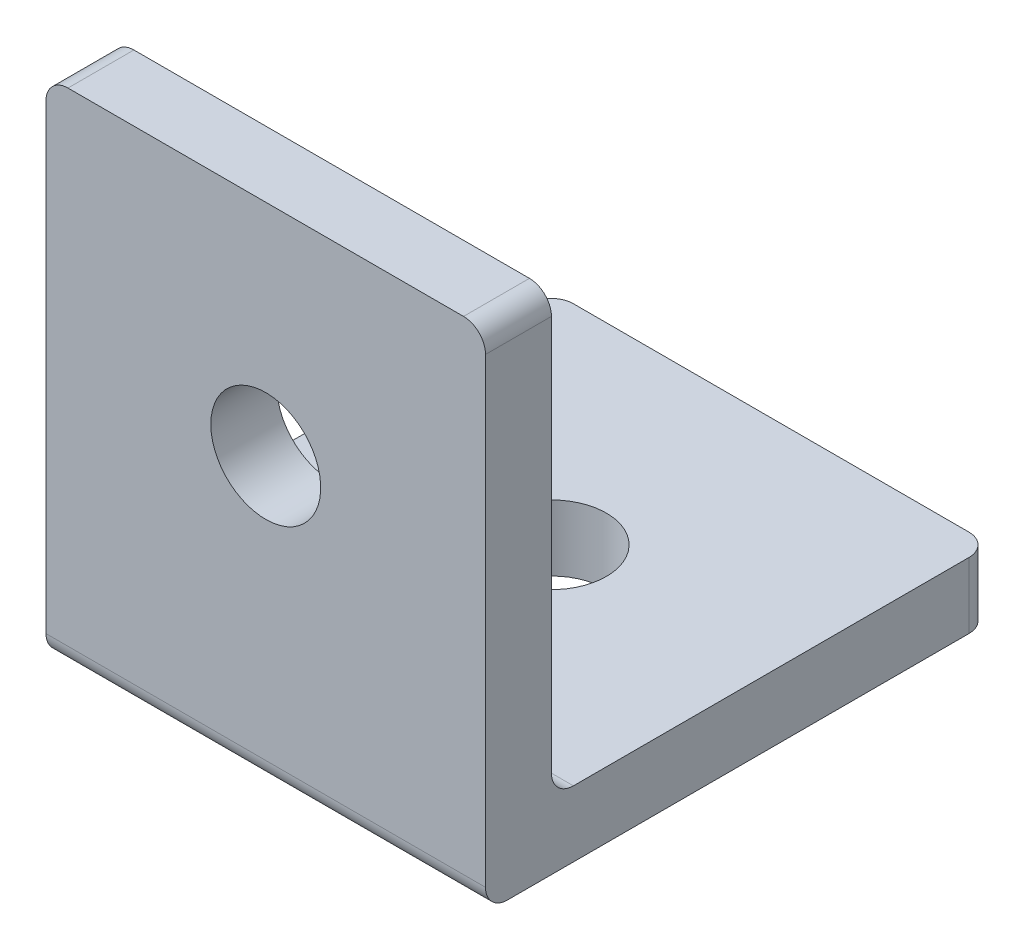
ISO-10303-21;
HEADER;
FILE_DESCRIPTION(('STEP AP214'),'2;1');
FILE_NAME('part.step','',(''),(''),'','','');
FILE_SCHEMA(('AUTOMOTIVE_DESIGN { 1 0 10303 214 1 1 1 1 }'));
ENDSEC;
DATA;
#1=APPLICATION_CONTEXT('core data for automotive mechanical design processes');
#2=APPLICATION_PROTOCOL_DEFINITION('international standard','automotive_design',2000,#1);
#3=PRODUCT_CONTEXT('',#1,'mechanical');
#4=PRODUCT('Part','Part','',(#3));
#5=PRODUCT_RELATED_PRODUCT_CATEGORY('part','',(#4));
#6=PRODUCT_DEFINITION_FORMATION('','',#4);
#7=PRODUCT_DEFINITION_CONTEXT('part definition',#1,'design');
#8=PRODUCT_DEFINITION('design','',#6,#7);
#9=PRODUCT_DEFINITION_SHAPE('','',#8);
#10=(LENGTH_UNIT() NAMED_UNIT(*) SI_UNIT(.MILLI.,.METRE.));
#11=(NAMED_UNIT(*) PLANE_ANGLE_UNIT() SI_UNIT($,.RADIAN.));
#12=(NAMED_UNIT(*) SI_UNIT($,.STERADIAN.) SOLID_ANGLE_UNIT());
#13=UNCERTAINTY_MEASURE_WITH_UNIT(LENGTH_MEASURE(1.E-05),#10,'distance_accuracy_value','');
#14=(GEOMETRIC_REPRESENTATION_CONTEXT(3) GLOBAL_UNCERTAINTY_ASSIGNED_CONTEXT((#13)) GLOBAL_UNIT_ASSIGNED_CONTEXT((#10,
#11,#12)) REPRESENTATION_CONTEXT('',''));
#15=CARTESIAN_POINT('',(0.,0.,0.));
#16=DIRECTION('',(0.,0.,1.));
#17=DIRECTION('',(1.,0.,0.));
#18=AXIS2_PLACEMENT_3D('',#15,#16,#17);
#19=CARTESIAN_POINT('',(-20.,0.,-23.));
#20=DIRECTION('',(0.,0.,-1.));
#21=DIRECTION('',(-1.,0.,0.));
#22=AXIS2_PLACEMENT_3D('',#19,#20,#21);
#23=PLANE('',#22);
#24=DIRECTION('',(1.,0.,0.));
#25=VECTOR('',#24,1.);
#26=CARTESIAN_POINT('',(-20.,0.,-23.));
#27=LINE('',#26,#25);
#28=CARTESIAN_POINT('',(-19.,0.,-23.));
#29=VERTEX_POINT('',#28);
#30=CARTESIAN_POINT('',(-1.,0.,-23.));
#31=VERTEX_POINT('',#30);
#32=EDGE_CURVE('E175',#29,#31,#27,.T.);
#33=ORIENTED_EDGE('',*,*,#32,.F.);
#34=DIRECTION('',(0.,1.,0.));
#35=VECTOR('',#34,1.);
#36=CARTESIAN_POINT('',(-19.,3.,-23.));
#37=LINE('',#36,#35);
#38=CARTESIAN_POINT('',(-19.,3.,-23.));
#39=VERTEX_POINT('',#38);
#40=EDGE_CURVE('E193',#29,#39,#37,.T.);
#41=ORIENTED_EDGE('',*,*,#40,.T.);
#42=DIRECTION('',(1.,0.,0.));
#43=VECTOR('',#42,1.);
#44=CARTESIAN_POINT('',(-20.,3.,-23.));
#45=LINE('',#44,#43);
#46=CARTESIAN_POINT('',(-1.,3.,-23.));
#47=VERTEX_POINT('',#46);
#48=EDGE_CURVE('E143',#39,#47,#45,.T.);
#49=ORIENTED_EDGE('',*,*,#48,.T.);
#50=DIRECTION('',(0.,1.,0.));
#51=VECTOR('',#50,1.);
#52=CARTESIAN_POINT('',(-1.,0.,-23.));
#53=LINE('',#52,#51);
#54=EDGE_CURVE('E178',#47,#31,#53,.F.);
#55=ORIENTED_EDGE('',*,*,#54,.T.);
#56=EDGE_LOOP('',(#33,#41,#49,#55));
#57=FACE_BOUND('',#56,.T.);
#58=ADVANCED_FACE('F33',(#57),#23,.T.);
#59=CARTESIAN_POINT('',(-20.,0.,-1.00000000000001));
#60=DIRECTION('',(0.,-1.,0.));
#61=DIRECTION('',(0.,0.,-1.));
#62=AXIS2_PLACEMENT_3D('',#59,#60,#61);
#63=PLANE('',#62);
#64=CARTESIAN_POINT('',(-10.,0.,-13.));
#65=DIRECTION('',(0.,1.,0.));
#66=DIRECTION('',(0.,0.,1.));
#67=AXIS2_PLACEMENT_3D('',#64,#65,#66);
#68=CIRCLE('',#67,2.5);
#69=CARTESIAN_POINT('',(-10.,0.,-10.5));
#70=VERTEX_POINT('',#69);
#71=EDGE_CURVE('E301',#70,#70,#68,.T.);
#72=ORIENTED_EDGE('',*,*,#71,.T.);
#73=EDGE_LOOP('',(#72));
#74=FACE_BOUND('',#73,.T.);
#75=DIRECTION('',(0.,0.,-1.));
#76=VECTOR('',#75,1.);
#77=CARTESIAN_POINT('',(-20.,0.,-1.00000000000001));
#78=LINE('',#77,#76);
#79=CARTESIAN_POINT('',(-20.,0.,-1.00000000000001));
#80=VERTEX_POINT('',#79);
#81=CARTESIAN_POINT('',(-20.,0.,-22.));
#82=VERTEX_POINT('',#81);
#83=EDGE_CURVE('E158',#80,#82,#78,.T.);
#84=ORIENTED_EDGE('',*,*,#83,.T.);
#85=CARTESIAN_POINT('',(-19.,0.,-22.));
#86=DIRECTION('',(0.,-1.,0.));
#87=DIRECTION('',(0.,0.,-1.));
#88=AXIS2_PLACEMENT_3D('',#85,#86,#87);
#89=CIRCLE('',#88,1.);
#90=EDGE_CURVE('E205',#82,#29,#89,.T.);
#91=ORIENTED_EDGE('',*,*,#90,.T.);
#92=ORIENTED_EDGE('',*,*,#32,.T.);
#93=CARTESIAN_POINT('',(-1.,0.,-22.));
#94=DIRECTION('',(0.,-1.,0.));
#95=DIRECTION('',(0.,0.,-1.));
#96=AXIS2_PLACEMENT_3D('',#93,#94,#95);
#97=CIRCLE('',#96,1.);
#98=CARTESIAN_POINT('',(0.,0.,-22.));
#99=VERTEX_POINT('',#98);
#100=EDGE_CURVE('E203',#31,#99,#97,.T.);
#101=ORIENTED_EDGE('',*,*,#100,.T.);
#102=DIRECTION('',(0.,0.,-1.));
#103=VECTOR('',#102,1.);
#104=CARTESIAN_POINT('',(0.,0.,-1.00000000000001));
#105=LINE('',#104,#103);
#106=CARTESIAN_POINT('',(0.,0.,-1.00000000000001));
#107=VERTEX_POINT('',#106);
#108=EDGE_CURVE('E135',#107,#99,#105,.T.);
#109=ORIENTED_EDGE('',*,*,#108,.F.);
#110=DIRECTION('',(1.,0.,0.));
#111=VECTOR('',#110,1.);
#112=CARTESIAN_POINT('',(-20.,0.,-1.00000000000001));
#113=LINE('',#112,#111);
#114=EDGE_CURVE('E179',#80,#107,#113,.T.);
#115=ORIENTED_EDGE('',*,*,#114,.F.);
#116=EDGE_LOOP('',(#84,#91,#92,#101,#109,#115));
#117=FACE_BOUND('',#116,.T.);
#118=ADVANCED_FACE('F248',(#74,#117),#63,.T.);
#119=CARTESIAN_POINT('',(-20.,1.,-1.));
#120=DIRECTION('',(1.,0.,0.));
#121=DIRECTION('',(0.,0.,-1.));
#122=AXIS2_PLACEMENT_3D('',#119,#120,#121);
#123=CYLINDRICAL_SURFACE('',#122,1.);
#124=CARTESIAN_POINT('',(0.,1.,-1.));
#125=DIRECTION('',(1.,0.,0.));
#126=DIRECTION('',(0.,0.,1.));
#127=AXIS2_PLACEMENT_3D('',#124,#125,#126);
#128=CIRCLE('',#127,1.);
#129=CARTESIAN_POINT('',(0.,1.00000000000001,0.));
#130=VERTEX_POINT('',#129);
#131=EDGE_CURVE('E170',#130,#107,#128,.T.);
#132=ORIENTED_EDGE('',*,*,#131,.F.);
#133=DIRECTION('',(1.,0.,0.));
#134=VECTOR('',#133,1.);
#135=CARTESIAN_POINT('',(-20.,1.00000000000001,0.));
#136=LINE('',#135,#134);
#137=CARTESIAN_POINT('',(-20.,1.00000000000001,0.));
#138=VERTEX_POINT('',#137);
#139=EDGE_CURVE('E181',#138,#130,#136,.T.);
#140=ORIENTED_EDGE('',*,*,#139,.F.);
#141=CARTESIAN_POINT('',(-20.,1.,-1.));
#142=DIRECTION('',(1.,0.,0.));
#143=DIRECTION('',(0.,0.,1.));
#144=AXIS2_PLACEMENT_3D('',#141,#142,#143);
#145=CIRCLE('',#144,1.);
#146=EDGE_CURVE('E155',#138,#80,#145,.T.);
#147=ORIENTED_EDGE('',*,*,#146,.T.);
#148=ORIENTED_EDGE('',*,*,#114,.T.);
#149=EDGE_LOOP('',(#132,#140,#147,#148));
#150=FACE_BOUND('',#149,.T.);
#151=ADVANCED_FACE('F254',(#150),#123,.T.);
#152=CARTESIAN_POINT('',(-20.,1.00000000000001,0.));
#153=DIRECTION('',(0.,0.,1.));
#154=DIRECTION('',(1.,0.,0.));
#155=AXIS2_PLACEMENT_3D('',#152,#153,#154);
#156=PLANE('',#155);
#157=CARTESIAN_POINT('',(-10.,13.,0.));
#158=DIRECTION('',(0.,0.,-1.));
#159=DIRECTION('',(-1.,0.,0.));
#160=AXIS2_PLACEMENT_3D('',#157,#158,#159);
#161=CIRCLE('',#160,2.5);
#162=CARTESIAN_POINT('',(-12.5,13.,0.));
#163=VERTEX_POINT('',#162);
#164=EDGE_CURVE('E163',#163,#163,#161,.T.);
#165=ORIENTED_EDGE('',*,*,#164,.T.);
#166=EDGE_LOOP('',(#165));
#167=FACE_BOUND('',#166,.T.);
#168=DIRECTION('',(1.,0.,0.));
#169=VECTOR('',#168,1.);
#170=CARTESIAN_POINT('',(-20.,23.,0.));
#171=LINE('',#170,#169);
#172=CARTESIAN_POINT('',(-19.,23.,0.));
#173=VERTEX_POINT('',#172);
#174=CARTESIAN_POINT('',(-1.,23.,0.));
#175=VERTEX_POINT('',#174);
#176=EDGE_CURVE('E184',#173,#175,#171,.T.);
#177=ORIENTED_EDGE('',*,*,#176,.F.);
#178=CARTESIAN_POINT('',(-19.,22.,0.));
#179=DIRECTION('',(0.,0.,1.));
#180=DIRECTION('',(1.,0.,0.));
#181=AXIS2_PLACEMENT_3D('',#178,#179,#180);
#182=CIRCLE('',#181,1.);
#183=CARTESIAN_POINT('',(-20.,22.,0.));
#184=VERTEX_POINT('',#183);
#185=EDGE_CURVE('E56',#173,#184,#182,.T.);
#186=ORIENTED_EDGE('',*,*,#185,.T.);
#187=DIRECTION('',(0.,-1.,0.));
#188=VECTOR('',#187,1.);
#189=CARTESIAN_POINT('',(-20.,1.00000000000001,0.));
#190=LINE('',#189,#188);
#191=EDGE_CURVE('E150',#184,#138,#190,.T.);
#192=ORIENTED_EDGE('',*,*,#191,.T.);
#193=ORIENTED_EDGE('',*,*,#139,.T.);
#194=DIRECTION('',(0.,-1.,0.));
#195=VECTOR('',#194,1.);
#196=CARTESIAN_POINT('',(0.,1.00000000000001,0.));
#197=LINE('',#196,#195);
#198=CARTESIAN_POINT('',(0.,22.,0.));
#199=VERTEX_POINT('',#198);
#200=EDGE_CURVE('E168',#199,#130,#197,.T.);
#201=ORIENTED_EDGE('',*,*,#200,.F.);
#202=CARTESIAN_POINT('',(-1.,22.,0.));
#203=DIRECTION('',(0.,0.,1.));
#204=DIRECTION('',(1.,0.,0.));
#205=AXIS2_PLACEMENT_3D('',#202,#203,#204);
#206=CIRCLE('',#205,1.);
#207=EDGE_CURVE('E48',#199,#175,#206,.T.);
#208=ORIENTED_EDGE('',*,*,#207,.T.);
#209=EDGE_LOOP('',(#177,#186,#192,#193,#201,#208));
#210=FACE_BOUND('',#209,.T.);
#211=ADVANCED_FACE('F230',(#167,#210),#156,.T.);
#212=CARTESIAN_POINT('',(-20.,23.,0.));
#213=DIRECTION('',(0.,1.,0.));
#214=DIRECTION('',(0.,0.,1.));
#215=AXIS2_PLACEMENT_3D('',#212,#213,#214);
#216=PLANE('',#215);
#217=DIRECTION('',(1.,0.,0.));
#218=VECTOR('',#217,1.);
#219=CARTESIAN_POINT('',(-20.,23.,-3.));
#220=LINE('',#219,#218);
#221=CARTESIAN_POINT('',(-19.,23.,-3.));
#222=VERTEX_POINT('',#221);
#223=CARTESIAN_POINT('',(-1.,23.,-3.));
#224=VERTEX_POINT('',#223);
#225=EDGE_CURVE('E186',#222,#224,#220,.T.);
#226=ORIENTED_EDGE('',*,*,#225,.F.);
#227=DIRECTION('',(0.,0.,1.));
#228=VECTOR('',#227,1.);
#229=CARTESIAN_POINT('',(-19.,23.,0.));
#230=LINE('',#229,#228);
#231=EDGE_CURVE('E215',#222,#173,#230,.T.);
#232=ORIENTED_EDGE('',*,*,#231,.T.);
#233=ORIENTED_EDGE('',*,*,#176,.T.);
#234=DIRECTION('',(0.,0.,1.));
#235=VECTOR('',#234,1.);
#236=CARTESIAN_POINT('',(-1.,23.,0.));
#237=LINE('',#236,#235);
#238=EDGE_CURVE('E213',#175,#224,#237,.F.);
#239=ORIENTED_EDGE('',*,*,#238,.T.);
#240=EDGE_LOOP('',(#226,#232,#233,#239));
#241=FACE_BOUND('',#240,.T.);
#242=ADVANCED_FACE('F229',(#241),#216,.T.);
#243=CARTESIAN_POINT('',(-20.,4.00000000000001,-3.));
#244=DIRECTION('',(0.,0.,-1.));
#245=DIRECTION('',(-1.,0.,0.));
#246=AXIS2_PLACEMENT_3D('',#243,#244,#245);
#247=PLANE('',#246);
#248=CARTESIAN_POINT('',(-10.,13.,-3.));
#249=DIRECTION('',(0.,0.,-1.));
#250=DIRECTION('',(-1.,0.,0.));
#251=AXIS2_PLACEMENT_3D('',#248,#249,#250);
#252=CIRCLE('',#251,2.5);
#253=CARTESIAN_POINT('',(-12.5,13.,-3.));
#254=VERTEX_POINT('',#253);
#255=EDGE_CURVE('E304',#254,#254,#252,.T.);
#256=ORIENTED_EDGE('',*,*,#255,.F.);
#257=EDGE_LOOP('',(#256));
#258=FACE_BOUND('',#257,.T.);
#259=DIRECTION('',(0.,1.,0.));
#260=VECTOR('',#259,1.);
#261=CARTESIAN_POINT('',(-20.,4.00000000000001,-3.));
#262=LINE('',#261,#260);
#263=CARTESIAN_POINT('',(-20.,4.00000000000001,-3.));
#264=VERTEX_POINT('',#263);
#265=CARTESIAN_POINT('',(-20.,22.,-3.));
#266=VERTEX_POINT('',#265);
#267=EDGE_CURVE('E148',#264,#266,#262,.T.);
#268=ORIENTED_EDGE('',*,*,#267,.T.);
#269=CARTESIAN_POINT('',(-19.,22.,-3.));
#270=DIRECTION('',(0.,0.,-1.));
#271=DIRECTION('',(-1.,0.,0.));
#272=AXIS2_PLACEMENT_3D('',#269,#270,#271);
#273=CIRCLE('',#272,1.);
#274=EDGE_CURVE('E11',#266,#222,#273,.T.);
#275=ORIENTED_EDGE('',*,*,#274,.T.);
#276=ORIENTED_EDGE('',*,*,#225,.T.);
#277=CARTESIAN_POINT('',(-1.,22.,-3.));
#278=DIRECTION('',(0.,0.,-1.));
#279=DIRECTION('',(-1.,0.,0.));
#280=AXIS2_PLACEMENT_3D('',#277,#278,#279);
#281=CIRCLE('',#280,1.);
#282=CARTESIAN_POINT('',(0.,22.,-3.));
#283=VERTEX_POINT('',#282);
#284=EDGE_CURVE('E41',#224,#283,#281,.T.);
#285=ORIENTED_EDGE('',*,*,#284,.T.);
#286=DIRECTION('',(0.,1.,0.));
#287=VECTOR('',#286,1.);
#288=CARTESIAN_POINT('',(0.,4.00000000000001,-3.));
#289=LINE('',#288,#287);
#290=CARTESIAN_POINT('',(0.,4.00000000000001,-3.));
#291=VERTEX_POINT('',#290);
#292=EDGE_CURVE('E165',#291,#283,#289,.T.);
#293=ORIENTED_EDGE('',*,*,#292,.F.);
#294=DIRECTION('',(1.,0.,0.));
#295=VECTOR('',#294,1.);
#296=CARTESIAN_POINT('',(-20.,4.00000000000001,-3.));
#297=LINE('',#296,#295);
#298=EDGE_CURVE('E142',#264,#291,#297,.T.);
#299=ORIENTED_EDGE('',*,*,#298,.F.);
#300=EDGE_LOOP('',(#268,#275,#276,#285,#293,#299));
#301=FACE_BOUND('',#300,.T.);
#302=ADVANCED_FACE('F221',(#258,#301),#247,.T.);
#303=CARTESIAN_POINT('',(-20.,4.,-4.));
#304=DIRECTION('',(1.,0.,0.));
#305=DIRECTION('',(0.,0.,-1.));
#306=AXIS2_PLACEMENT_3D('',#303,#304,#305);
#307=CYLINDRICAL_SURFACE('',#306,1.);
#308=CARTESIAN_POINT('',(0.,4.,-4.));
#309=DIRECTION('',(-1.,0.,0.));
#310=DIRECTION('',(0.,0.,-1.));
#311=AXIS2_PLACEMENT_3D('',#308,#309,#310);
#312=CIRCLE('',#311,1.);
#313=CARTESIAN_POINT('',(0.,3.,-4.00000000000001));
#314=VERTEX_POINT('',#313);
#315=EDGE_CURVE('E141',#314,#291,#312,.T.);
#316=ORIENTED_EDGE('',*,*,#315,.F.);
#317=DIRECTION('',(1.,0.,0.));
#318=VECTOR('',#317,1.);
#319=CARTESIAN_POINT('',(-20.,3.,-4.00000000000001));
#320=LINE('',#319,#318);
#321=CARTESIAN_POINT('',(-20.,3.,-4.00000000000001));
#322=VERTEX_POINT('',#321);
#323=EDGE_CURVE('E128',#322,#314,#320,.T.);
#324=ORIENTED_EDGE('',*,*,#323,.F.);
#325=CARTESIAN_POINT('',(-20.,4.,-4.));
#326=DIRECTION('',(-1.,0.,0.));
#327=DIRECTION('',(0.,0.,-1.));
#328=AXIS2_PLACEMENT_3D('',#325,#326,#327);
#329=CIRCLE('',#328,1.);
#330=EDGE_CURVE('E134',#322,#264,#329,.T.);
#331=ORIENTED_EDGE('',*,*,#330,.T.);
#332=ORIENTED_EDGE('',*,*,#298,.T.);
#333=EDGE_LOOP('',(#316,#324,#331,#332));
#334=FACE_BOUND('',#333,.T.);
#335=ADVANCED_FACE('F139',(#334),#307,.F.);
#336=CARTESIAN_POINT('',(-20.,3.,-4.00000000000001));
#337=DIRECTION('',(0.,1.,0.));
#338=DIRECTION('',(0.,0.,1.));
#339=AXIS2_PLACEMENT_3D('',#336,#337,#338);
#340=PLANE('',#339);
#341=CARTESIAN_POINT('',(-10.,3.,-13.));
#342=DIRECTION('',(0.,1.,0.));
#343=DIRECTION('',(0.,0.,1.));
#344=AXIS2_PLACEMENT_3D('',#341,#342,#343);
#345=CIRCLE('',#344,2.5);
#346=CARTESIAN_POINT('',(-10.,3.,-10.5));
#347=VERTEX_POINT('',#346);
#348=EDGE_CURVE('E299',#347,#347,#345,.T.);
#349=ORIENTED_EDGE('',*,*,#348,.F.);
#350=EDGE_LOOP('',(#349));
#351=FACE_BOUND('',#350,.T.);
#352=ORIENTED_EDGE('',*,*,#48,.F.);
#353=CARTESIAN_POINT('',(-19.,3.,-22.));
#354=DIRECTION('',(0.,1.,0.));
#355=DIRECTION('',(0.,0.,1.));
#356=AXIS2_PLACEMENT_3D('',#353,#354,#355);
#357=CIRCLE('',#356,1.);
#358=CARTESIAN_POINT('',(-20.,3.,-22.));
#359=VERTEX_POINT('',#358);
#360=EDGE_CURVE('E130',#39,#359,#357,.T.);
#361=ORIENTED_EDGE('',*,*,#360,.T.);
#362=DIRECTION('',(0.,0.,1.));
#363=VECTOR('',#362,1.);
#364=CARTESIAN_POINT('',(-20.,3.,-4.00000000000001));
#365=LINE('',#364,#363);
#366=EDGE_CURVE('E123',#359,#322,#365,.T.);
#367=ORIENTED_EDGE('',*,*,#366,.T.);
#368=ORIENTED_EDGE('',*,*,#323,.T.);
#369=DIRECTION('',(0.,0.,1.));
#370=VECTOR('',#369,1.);
#371=CARTESIAN_POINT('',(0.,3.,-4.00000000000001));
#372=LINE('',#371,#370);
#373=CARTESIAN_POINT('',(0.,3.,-22.));
#374=VERTEX_POINT('',#373);
#375=EDGE_CURVE('E161',#374,#314,#372,.T.);
#376=ORIENTED_EDGE('',*,*,#375,.F.);
#377=CARTESIAN_POINT('',(-1.,3.,-22.));
#378=DIRECTION('',(0.,1.,0.));
#379=DIRECTION('',(0.,0.,1.));
#380=AXIS2_PLACEMENT_3D('',#377,#378,#379);
#381=CIRCLE('',#380,1.);
#382=EDGE_CURVE('E196',#374,#47,#381,.T.);
#383=ORIENTED_EDGE('',*,*,#382,.T.);
#384=EDGE_LOOP('',(#352,#361,#367,#368,#376,#383));
#385=FACE_BOUND('',#384,.T.);
#386=ADVANCED_FACE('F126',(#351,#385),#340,.T.);
#387=CARTESIAN_POINT('',(-20.,4.,-4.));
#388=DIRECTION('',(1.,0.,0.));
#389=DIRECTION('',(0.,0.,-1.));
#390=AXIS2_PLACEMENT_3D('',#387,#388,#389);
#391=PLANE('',#390);
#392=ORIENTED_EDGE('',*,*,#366,.F.);
#393=DIRECTION('',(0.,1.,0.));
#394=VECTOR('',#393,1.);
#395=CARTESIAN_POINT('',(-20.,0.,-22.));
#396=LINE('',#395,#394);
#397=EDGE_CURVE('E201',#359,#82,#396,.F.);
#398=ORIENTED_EDGE('',*,*,#397,.T.);
#399=ORIENTED_EDGE('',*,*,#83,.F.);
#400=ORIENTED_EDGE('',*,*,#146,.F.);
#401=ORIENTED_EDGE('',*,*,#191,.F.);
#402=DIRECTION('',(0.,0.,1.));
#403=VECTOR('',#402,1.);
#404=CARTESIAN_POINT('',(-20.,22.,-3.));
#405=LINE('',#404,#403);
#406=EDGE_CURVE('E199',#184,#266,#405,.F.);
#407=ORIENTED_EDGE('',*,*,#406,.T.);
#408=ORIENTED_EDGE('',*,*,#267,.F.);
#409=ORIENTED_EDGE('',*,*,#330,.F.);
#410=EDGE_LOOP('',(#392,#398,#399,#400,#401,#407,#408,#409));
#411=FACE_BOUND('',#410,.T.);
#412=ADVANCED_FACE('F146',(#411),#391,.F.);
#413=CARTESIAN_POINT('',(0.,4.,-4.));
#414=DIRECTION('',(1.,0.,0.));
#415=DIRECTION('',(0.,0.,-1.));
#416=AXIS2_PLACEMENT_3D('',#413,#414,#415);
#417=PLANE('',#416);
#418=ORIENTED_EDGE('',*,*,#108,.T.);
#419=DIRECTION('',(0.,1.,0.));
#420=VECTOR('',#419,1.);
#421=CARTESIAN_POINT('',(0.,4.,-22.));
#422=LINE('',#421,#420);
#423=EDGE_CURVE('E210',#99,#374,#422,.T.);
#424=ORIENTED_EDGE('',*,*,#423,.T.);
#425=ORIENTED_EDGE('',*,*,#375,.T.);
#426=ORIENTED_EDGE('',*,*,#315,.T.);
#427=ORIENTED_EDGE('',*,*,#292,.T.);
#428=DIRECTION('',(0.,0.,1.));
#429=VECTOR('',#428,1.);
#430=CARTESIAN_POINT('',(0.,22.,-4.));
#431=LINE('',#430,#429);
#432=EDGE_CURVE('E207',#283,#199,#431,.T.);
#433=ORIENTED_EDGE('',*,*,#432,.T.);
#434=ORIENTED_EDGE('',*,*,#200,.T.);
#435=ORIENTED_EDGE('',*,*,#131,.T.);
#436=EDGE_LOOP('',(#418,#424,#425,#426,#427,#433,#434,#435));
#437=FACE_BOUND('',#436,.T.);
#438=ADVANCED_FACE('F227',(#437),#417,.T.);
#439=CARTESIAN_POINT('',(-19.,0.,-22.));
#440=DIRECTION('',(0.,-1.,0.));
#441=DIRECTION('',(0.,0.,-1.));
#442=AXIS2_PLACEMENT_3D('',#439,#440,#441);
#443=CYLINDRICAL_SURFACE('',#442,1.);
#444=ORIENTED_EDGE('',*,*,#90,.F.);
#445=ORIENTED_EDGE('',*,*,#397,.F.);
#446=ORIENTED_EDGE('',*,*,#360,.F.);
#447=ORIENTED_EDGE('',*,*,#40,.F.);
#448=EDGE_LOOP('',(#444,#445,#446,#447));
#449=FACE_BOUND('',#448,.T.);
#450=ADVANCED_FACE('F244',(#449),#443,.T.);
#451=CARTESIAN_POINT('',(-1.,4.,-22.));
#452=DIRECTION('',(0.,1.,0.));
#453=DIRECTION('',(0.,0.,1.));
#454=AXIS2_PLACEMENT_3D('',#451,#452,#453);
#455=CYLINDRICAL_SURFACE('',#454,1.);
#456=ORIENTED_EDGE('',*,*,#100,.F.);
#457=ORIENTED_EDGE('',*,*,#54,.F.);
#458=ORIENTED_EDGE('',*,*,#382,.F.);
#459=ORIENTED_EDGE('',*,*,#423,.F.);
#460=EDGE_LOOP('',(#456,#457,#458,#459));
#461=FACE_BOUND('',#460,.T.);
#462=ADVANCED_FACE('F238',(#461),#455,.T.);
#463=CARTESIAN_POINT('',(-19.,22.,0.));
#464=DIRECTION('',(0.,0.,-1.));
#465=DIRECTION('',(-1.,0.,0.));
#466=AXIS2_PLACEMENT_3D('',#463,#464,#465);
#467=CYLINDRICAL_SURFACE('',#466,1.);
#468=ORIENTED_EDGE('',*,*,#274,.F.);
#469=ORIENTED_EDGE('',*,*,#406,.F.);
#470=ORIENTED_EDGE('',*,*,#185,.F.);
#471=ORIENTED_EDGE('',*,*,#231,.F.);
#472=EDGE_LOOP('',(#468,#469,#470,#471));
#473=FACE_BOUND('',#472,.T.);
#474=ADVANCED_FACE('F236',(#473),#467,.T.);
#475=CARTESIAN_POINT('',(-1.,22.,-4.));
#476=DIRECTION('',(0.,0.,1.));
#477=DIRECTION('',(1.,0.,0.));
#478=AXIS2_PLACEMENT_3D('',#475,#476,#477);
#479=CYLINDRICAL_SURFACE('',#478,1.);
#480=ORIENTED_EDGE('',*,*,#284,.F.);
#481=ORIENTED_EDGE('',*,*,#238,.F.);
#482=ORIENTED_EDGE('',*,*,#207,.F.);
#483=ORIENTED_EDGE('',*,*,#432,.F.);
#484=EDGE_LOOP('',(#480,#481,#482,#483));
#485=FACE_BOUND('',#484,.T.);
#486=ADVANCED_FACE('F35',(#485),#479,.T.);
#487=CARTESIAN_POINT('',(-10.,13.,0.));
#488=DIRECTION('',(0.,0.,-1.));
#489=DIRECTION('',(-1.,0.,0.));
#490=AXIS2_PLACEMENT_3D('',#487,#488,#489);
#491=CYLINDRICAL_SURFACE('',#490,2.5);
#492=ORIENTED_EDGE('',*,*,#164,.F.);
#493=EDGE_LOOP('',(#492));
#494=FACE_BOUND('',#493,.T.);
#495=ORIENTED_EDGE('',*,*,#255,.T.);
#496=EDGE_LOOP('',(#495));
#497=FACE_BOUND('',#496,.T.);
#498=ADVANCED_FACE('F243',(#494,#497),#491,.F.);
#499=CARTESIAN_POINT('',(-10.,0.,-13.));
#500=DIRECTION('',(0.,1.,0.));
#501=DIRECTION('',(0.,0.,1.));
#502=AXIS2_PLACEMENT_3D('',#499,#500,#501);
#503=CYLINDRICAL_SURFACE('',#502,2.5);
#504=ORIENTED_EDGE('',*,*,#71,.F.);
#505=EDGE_LOOP('',(#504));
#506=FACE_BOUND('',#505,.T.);
#507=ORIENTED_EDGE('',*,*,#348,.T.);
#508=EDGE_LOOP('',(#507));
#509=FACE_BOUND('',#508,.T.);
#510=ADVANCED_FACE('F312',(#506,#509),#503,.F.);
#511=CLOSED_SHELL('',(#58,#118,#151,#211,#242,#302,#335,#386,#412,#438,#450,#462,#474,#486,#498,#510));
#512=MANIFOLD_SOLID_BREP('B2',#511);
#513=ADVANCED_BREP_SHAPE_REPRESENTATION('',(#18,#512),#14);
#514=SHAPE_DEFINITION_REPRESENTATION(#9,#513);
ENDSEC;
END-ISO-10303-21;
